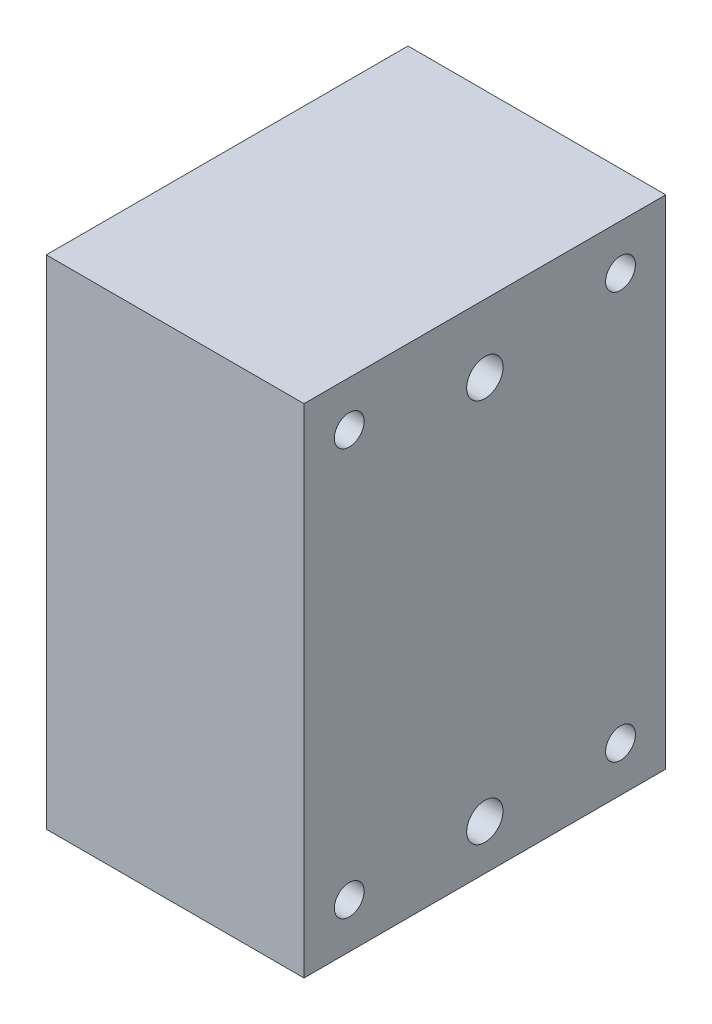
ISO-10303-21;
HEADER;
FILE_DESCRIPTION(('STEP AP214'),'2;1');
FILE_NAME('part.step','',(''),(''),'','','');
FILE_SCHEMA(('AUTOMOTIVE_DESIGN { 1 0 10303 214 1 1 1 1 }'));
ENDSEC;
DATA;
#1=APPLICATION_CONTEXT('core data for automotive mechanical design processes');
#2=APPLICATION_PROTOCOL_DEFINITION('international standard','automotive_design',2000,#1);
#3=PRODUCT_CONTEXT('',#1,'mechanical');
#4=PRODUCT('Part','Part','',(#3));
#5=PRODUCT_RELATED_PRODUCT_CATEGORY('part','',(#4));
#6=PRODUCT_DEFINITION_FORMATION('','',#4);
#7=PRODUCT_DEFINITION_CONTEXT('part definition',#1,'design');
#8=PRODUCT_DEFINITION('design','',#6,#7);
#9=PRODUCT_DEFINITION_SHAPE('','',#8);
#10=(LENGTH_UNIT() NAMED_UNIT(*) SI_UNIT(.MILLI.,.METRE.));
#11=(NAMED_UNIT(*) PLANE_ANGLE_UNIT() SI_UNIT($,.RADIAN.));
#12=(NAMED_UNIT(*) SI_UNIT($,.STERADIAN.) SOLID_ANGLE_UNIT());
#13=UNCERTAINTY_MEASURE_WITH_UNIT(LENGTH_MEASURE(1.E-05),#10,'distance_accuracy_value','');
#14=(GEOMETRIC_REPRESENTATION_CONTEXT(3) GLOBAL_UNCERTAINTY_ASSIGNED_CONTEXT((#13)) GLOBAL_UNIT_ASSIGNED_CONTEXT((#10,
#11,#12)) REPRESENTATION_CONTEXT('',''));
#15=CARTESIAN_POINT('',(0.,0.,0.));
#16=DIRECTION('',(0.,0.,1.));
#17=DIRECTION('',(1.,0.,0.));
#18=AXIS2_PLACEMENT_3D('',#15,#16,#17);
#19=CARTESIAN_POINT('',(7.99999999998136,20.,0.));
#20=DIRECTION('',(-1.,0.,0.));
#21=DIRECTION('',(0.,0.,1.));
#22=AXIS2_PLACEMENT_3D('',#19,#20,#21);
#23=CONICAL_SURFACE('',#22,1.89999999992098,1.02974425854218);
#24=CARTESIAN_POINT('',(9.14163517620636,20.,-8.52790060790198E-11));
#25=VERTEX_POINT('',#24);
#26=VERTEX_LOOP('',#25);
#27=FACE_BOUND('',#26,.T.);
#28=CARTESIAN_POINT('',(7.99999999999999,20.,0.));
#29=DIRECTION('',(-1.,0.,0.));
#30=DIRECTION('',(0.,0.,1.));
#31=AXIS2_PLACEMENT_3D('',#28,#29,#30);
#32=CIRCLE('',#31,1.9);
#33=CARTESIAN_POINT('',(7.99999999999999,20.,1.89999999999999));
#34=VERTEX_POINT('',#33);
#35=EDGE_CURVE('E95',#34,#34,#32,.T.);
#36=ORIENTED_EDGE('',*,*,#35,.T.);
#37=EDGE_LOOP('',(#36));
#38=FACE_BOUND('',#37,.T.);
#39=ADVANCED_FACE('F16',(#27,#38),#23,.F.);
#40=CARTESIAN_POINT('',(7.99999999998136,-22.5,0.));
#41=DIRECTION('',(-1.,0.,0.));
#42=DIRECTION('',(0.,0.,1.));
#43=AXIS2_PLACEMENT_3D('',#40,#41,#42);
#44=CONICAL_SURFACE('',#43,1.89999999992098,1.02974425854218);
#45=CARTESIAN_POINT('',(9.14163517614952,-22.5,1.98951966012828E-10));
#46=VERTEX_POINT('',#45);
#47=VERTEX_LOOP('',#46);
#48=FACE_BOUND('',#47,.T.);
#49=CARTESIAN_POINT('',(7.99999999999999,-22.5,0.));
#50=DIRECTION('',(-1.,0.,0.));
#51=DIRECTION('',(0.,0.,1.));
#52=AXIS2_PLACEMENT_3D('',#49,#50,#51);
#53=CIRCLE('',#52,1.9);
#54=CARTESIAN_POINT('',(7.99999999999999,-22.5,1.89999999999999));
#55=VERTEX_POINT('',#54);
#56=EDGE_CURVE('E97',#55,#55,#53,.T.);
#57=ORIENTED_EDGE('',*,*,#56,.T.);
#58=EDGE_LOOP('',(#57));
#59=FACE_BOUND('',#58,.T.);
#60=ADVANCED_FACE('F92',(#48,#59),#44,.F.);
#61=CARTESIAN_POINT('',(0.,20.,0.));
#62=DIRECTION('',(-1.,0.,0.));
#63=DIRECTION('',(0.,0.,1.));
#64=AXIS2_PLACEMENT_3D('',#61,#62,#63);
#65=CYLINDRICAL_SURFACE('',#64,1.9);
#66=ORIENTED_EDGE('',*,*,#35,.F.);
#67=EDGE_LOOP('',(#66));
#68=FACE_BOUND('',#67,.T.);
#69=CARTESIAN_POINT('',(5.,20.,0.));
#70=DIRECTION('',(-1.,0.,0.));
#71=DIRECTION('',(0.,0.,1.));
#72=AXIS2_PLACEMENT_3D('',#69,#70,#71);
#73=CIRCLE('',#72,1.9);
#74=CARTESIAN_POINT('',(5.,20.,1.89999999999999));
#75=VERTEX_POINT('',#74);
#76=EDGE_CURVE('E19',#75,#75,#73,.T.);
#77=ORIENTED_EDGE('',*,*,#76,.T.);
#78=EDGE_LOOP('',(#77));
#79=FACE_BOUND('',#78,.T.);
#80=ADVANCED_FACE('F170',(#68,#79),#65,.F.);
#81=CARTESIAN_POINT('',(0.,-22.5,0.));
#82=DIRECTION('',(-1.,0.,0.));
#83=DIRECTION('',(0.,0.,1.));
#84=AXIS2_PLACEMENT_3D('',#81,#82,#83);
#85=CYLINDRICAL_SURFACE('',#84,1.9);
#86=ORIENTED_EDGE('',*,*,#56,.F.);
#87=EDGE_LOOP('',(#86));
#88=FACE_BOUND('',#87,.T.);
#89=CARTESIAN_POINT('',(5.,-22.5,0.));
#90=DIRECTION('',(-1.,0.,0.));
#91=DIRECTION('',(0.,0.,1.));
#92=AXIS2_PLACEMENT_3D('',#89,#90,#91);
#93=CIRCLE('',#92,1.9);
#94=CARTESIAN_POINT('',(5.,-22.5,1.89999999999999));
#95=VERTEX_POINT('',#94);
#96=EDGE_CURVE('E160',#95,#95,#93,.T.);
#97=ORIENTED_EDGE('',*,*,#96,.T.);
#98=EDGE_LOOP('',(#97));
#99=FACE_BOUND('',#98,.T.);
#100=ADVANCED_FACE('F305',(#88,#99),#85,.F.);
#101=CARTESIAN_POINT('',(20.5000000000268,20.,0.));
#102=DIRECTION('',(1.,0.,0.));
#103=DIRECTION('',(0.,0.,-1.));
#104=AXIS2_PLACEMENT_3D('',#101,#102,#103);
#105=CONICAL_SURFACE('',#104,1.89999999992095,1.02974425854217);
#106=CARTESIAN_POINT('',(19.3583648238018,20.,8.52512505034042E-11));
#107=VERTEX_POINT('',#106);
#108=VERTEX_LOOP('',#107);
#109=FACE_BOUND('',#108,.T.);
#110=CARTESIAN_POINT('',(20.5,20.,0.));
#111=DIRECTION('',(1.,0.,0.));
#112=DIRECTION('',(0.,0.,-1.));
#113=AXIS2_PLACEMENT_3D('',#110,#111,#112);
#114=CIRCLE('',#113,1.90000000000001);
#115=CARTESIAN_POINT('',(20.5,20.,-1.90000000000002));
#116=VERTEX_POINT('',#115);
#117=EDGE_CURVE('E162',#116,#116,#114,.T.);
#118=ORIENTED_EDGE('',*,*,#117,.T.);
#119=EDGE_LOOP('',(#118));
#120=FACE_BOUND('',#119,.T.);
#121=ADVANCED_FACE('F302',(#109,#120),#105,.F.);
#122=CARTESIAN_POINT('',(20.5000000000268,-22.5,0.));
#123=DIRECTION('',(1.,0.,0.));
#124=DIRECTION('',(0.,0.,-1.));
#125=AXIS2_PLACEMENT_3D('',#122,#123,#124);
#126=CONICAL_SURFACE('',#125,1.89999999992095,1.02974425854217);
#127=CARTESIAN_POINT('',(19.3583648238587,-22.5,-1.98951966012828E-10));
#128=VERTEX_POINT('',#127);
#129=VERTEX_LOOP('',#128);
#130=FACE_BOUND('',#129,.T.);
#131=CARTESIAN_POINT('',(20.5,-22.5,0.));
#132=DIRECTION('',(1.,0.,0.));
#133=DIRECTION('',(0.,0.,-1.));
#134=AXIS2_PLACEMENT_3D('',#131,#132,#133);
#135=CIRCLE('',#134,1.90000000000001);
#136=CARTESIAN_POINT('',(20.5,-22.5,-1.90000000000002));
#137=VERTEX_POINT('',#136);
#138=EDGE_CURVE('E166',#137,#137,#135,.T.);
#139=ORIENTED_EDGE('',*,*,#138,.T.);
#140=EDGE_LOOP('',(#139));
#141=FACE_BOUND('',#140,.T.);
#142=ADVANCED_FACE('F304',(#130,#141),#126,.F.);
#143=CARTESIAN_POINT('',(11.5000000000691,22.5,-15.));
#144=DIRECTION('',(-1.,0.,0.));
#145=DIRECTION('',(0.,0.,1.));
#146=AXIS2_PLACEMENT_3D('',#143,#144,#145);
#147=CONICAL_SURFACE('',#146,1.64999999994052,1.02974425858201);
#148=CARTESIAN_POINT('',(12.4914200214619,22.5,-14.9999999999432));
#149=VERTEX_POINT('',#148);
#150=VERTEX_LOOP('',#149);
#151=FACE_BOUND('',#150,.T.);
#152=CARTESIAN_POINT('',(11.5,22.5,-15.));
#153=DIRECTION('',(-1.,0.,0.));
#154=DIRECTION('',(0.,0.,1.));
#155=AXIS2_PLACEMENT_3D('',#152,#153,#154);
#156=CIRCLE('',#155,1.64999999999999);
#157=CARTESIAN_POINT('',(11.5,22.5,-13.35));
#158=VERTEX_POINT('',#157);
#159=EDGE_CURVE('E581',#158,#158,#156,.T.);
#160=ORIENTED_EDGE('',*,*,#159,.T.);
#161=EDGE_LOOP('',(#160));
#162=FACE_BOUND('',#161,.T.);
#163=ADVANCED_FACE('F312',(#151,#162),#147,.F.);
#164=CARTESIAN_POINT('',(11.5000000000691,22.5,15.));
#165=DIRECTION('',(-1.,0.,0.));
#166=DIRECTION('',(0.,0.,1.));
#167=AXIS2_PLACEMENT_3D('',#164,#165,#166);
#168=CONICAL_SURFACE('',#167,1.64999999997009,1.02974425859784);
#169=CARTESIAN_POINT('',(12.4914200214903,22.5,15.));
#170=VERTEX_POINT('',#169);
#171=VERTEX_LOOP('',#170);
#172=FACE_BOUND('',#171,.T.);
#173=CARTESIAN_POINT('',(11.5,22.5,15.));
#174=DIRECTION('',(-1.,0.,0.));
#175=DIRECTION('',(0.,0.,1.));
#176=AXIS2_PLACEMENT_3D('',#173,#174,#175);
#177=CIRCLE('',#176,1.64999999999999);
#178=CARTESIAN_POINT('',(11.5,22.5,16.65));
#179=VERTEX_POINT('',#178);
#180=EDGE_CURVE('E576',#179,#179,#177,.T.);
#181=ORIENTED_EDGE('',*,*,#180,.T.);
#182=EDGE_LOOP('',(#181));
#183=FACE_BOUND('',#182,.T.);
#184=ADVANCED_FACE('F360',(#172,#183),#168,.F.);
#185=CARTESIAN_POINT('',(11.5000000000691,-22.5,15.));
#186=DIRECTION('',(-1.,0.,0.));
#187=DIRECTION('',(0.,0.,1.));
#188=AXIS2_PLACEMENT_3D('',#185,#186,#187);
#189=CONICAL_SURFACE('',#188,1.64999999997009,1.02974425859784);
#190=CARTESIAN_POINT('',(12.4914200214903,-22.5,15.));
#191=VERTEX_POINT('',#190);
#192=VERTEX_LOOP('',#191);
#193=FACE_BOUND('',#192,.T.);
#194=CARTESIAN_POINT('',(11.5,-22.5,15.));
#195=DIRECTION('',(-1.,0.,0.));
#196=DIRECTION('',(0.,0.,1.));
#197=AXIS2_PLACEMENT_3D('',#194,#195,#196);
#198=CIRCLE('',#197,1.64999999999999);
#199=CARTESIAN_POINT('',(11.5,-22.5,16.65));
#200=VERTEX_POINT('',#199);
#201=EDGE_CURVE('E574',#200,#200,#198,.T.);
#202=ORIENTED_EDGE('',*,*,#201,.T.);
#203=EDGE_LOOP('',(#202));
#204=FACE_BOUND('',#203,.T.);
#205=ADVANCED_FACE('F186',(#193,#204),#189,.F.);
#206=CARTESIAN_POINT('',(11.5000000000691,-22.5,-15.));
#207=DIRECTION('',(-1.,0.,0.));
#208=DIRECTION('',(0.,0.,1.));
#209=AXIS2_PLACEMENT_3D('',#206,#207,#208);
#210=CONICAL_SURFACE('',#209,1.64999999994052,1.02974425858201);
#211=CARTESIAN_POINT('',(12.4914200214619,-22.5,-14.9999999999432));
#212=VERTEX_POINT('',#211);
#213=VERTEX_LOOP('',#212);
#214=FACE_BOUND('',#213,.T.);
#215=CARTESIAN_POINT('',(11.5,-22.5,-15.));
#216=DIRECTION('',(-1.,0.,0.));
#217=DIRECTION('',(0.,0.,1.));
#218=AXIS2_PLACEMENT_3D('',#215,#216,#217);
#219=CIRCLE('',#218,1.64999999999999);
#220=CARTESIAN_POINT('',(11.5,-22.5,-13.35));
#221=VERTEX_POINT('',#220);
#222=EDGE_CURVE('E159',#221,#221,#219,.T.);
#223=ORIENTED_EDGE('',*,*,#222,.T.);
#224=EDGE_LOOP('',(#223));
#225=FACE_BOUND('',#224,.T.);
#226=ADVANCED_FACE('F175',(#214,#225),#210,.F.);
#227=CARTESIAN_POINT('',(5.,21.9,0.));
#228=DIRECTION('',(1.,0.,0.));
#229=DIRECTION('',(0.,0.,-1.));
#230=AXIS2_PLACEMENT_3D('',#227,#228,#229);
#231=PLANE('',#230);
#232=CARTESIAN_POINT('',(5.,20.,0.));
#233=DIRECTION('',(-1.,0.,0.));
#234=DIRECTION('',(0.,0.,1.));
#235=AXIS2_PLACEMENT_3D('',#232,#233,#234);
#236=CIRCLE('',#235,2.01);
#237=CARTESIAN_POINT('',(5.,20.,2.00999999999999));
#238=VERTEX_POINT('',#237);
#239=EDGE_CURVE('E157',#238,#238,#236,.T.);
#240=ORIENTED_EDGE('',*,*,#239,.T.);
#241=EDGE_LOOP('',(#240));
#242=FACE_BOUND('',#241,.T.);
#243=ORIENTED_EDGE('',*,*,#76,.F.);
#244=EDGE_LOOP('',(#243));
#245=FACE_BOUND('',#244,.T.);
#246=ADVANCED_FACE('F172',(#242,#245),#231,.F.);
#247=CARTESIAN_POINT('',(5.,-20.6,0.));
#248=DIRECTION('',(1.,0.,0.));
#249=DIRECTION('',(0.,0.,-1.));
#250=AXIS2_PLACEMENT_3D('',#247,#248,#249);
#251=PLANE('',#250);
#252=CARTESIAN_POINT('',(5.,-22.5,0.));
#253=DIRECTION('',(-1.,0.,0.));
#254=DIRECTION('',(0.,0.,1.));
#255=AXIS2_PLACEMENT_3D('',#252,#253,#254);
#256=CIRCLE('',#255,2.01);
#257=CARTESIAN_POINT('',(5.,-22.5,2.00999999999999));
#258=VERTEX_POINT('',#257);
#259=EDGE_CURVE('E154',#258,#258,#256,.T.);
#260=ORIENTED_EDGE('',*,*,#259,.T.);
#261=EDGE_LOOP('',(#260));
#262=FACE_BOUND('',#261,.T.);
#263=ORIENTED_EDGE('',*,*,#96,.F.);
#264=EDGE_LOOP('',(#263));
#265=FACE_BOUND('',#264,.T.);
#266=ADVANCED_FACE('F174',(#262,#265),#251,.F.);
#267=CARTESIAN_POINT('',(28.5,20.,0.));
#268=DIRECTION('',(1.,0.,0.));
#269=DIRECTION('',(0.,0.,-1.));
#270=AXIS2_PLACEMENT_3D('',#267,#268,#269);
#271=CYLINDRICAL_SURFACE('',#270,1.90000000000001);
#272=ORIENTED_EDGE('',*,*,#117,.F.);
#273=EDGE_LOOP('',(#272));
#274=FACE_BOUND('',#273,.T.);
#275=CARTESIAN_POINT('',(23.5,20.,0.));
#276=DIRECTION('',(1.,0.,0.));
#277=DIRECTION('',(0.,0.,-1.));
#278=AXIS2_PLACEMENT_3D('',#275,#276,#277);
#279=CIRCLE('',#278,1.90000000000001);
#280=CARTESIAN_POINT('',(23.5,20.,-1.90000000000002));
#281=VERTEX_POINT('',#280);
#282=EDGE_CURVE('E151',#281,#281,#279,.T.);
#283=ORIENTED_EDGE('',*,*,#282,.T.);
#284=EDGE_LOOP('',(#283));
#285=FACE_BOUND('',#284,.T.);
#286=ADVANCED_FACE('F183',(#274,#285),#271,.F.);
#287=CARTESIAN_POINT('',(28.5,-22.5,0.));
#288=DIRECTION('',(1.,0.,0.));
#289=DIRECTION('',(0.,0.,-1.));
#290=AXIS2_PLACEMENT_3D('',#287,#288,#289);
#291=CYLINDRICAL_SURFACE('',#290,1.90000000000001);
#292=ORIENTED_EDGE('',*,*,#138,.F.);
#293=EDGE_LOOP('',(#292));
#294=FACE_BOUND('',#293,.T.);
#295=CARTESIAN_POINT('',(23.5,-22.5,0.));
#296=DIRECTION('',(1.,0.,0.));
#297=DIRECTION('',(0.,0.,-1.));
#298=AXIS2_PLACEMENT_3D('',#295,#296,#297);
#299=CIRCLE('',#298,1.90000000000001);
#300=CARTESIAN_POINT('',(23.5,-22.5,-1.90000000000002));
#301=VERTEX_POINT('',#300);
#302=EDGE_CURVE('E148',#301,#301,#299,.T.);
#303=ORIENTED_EDGE('',*,*,#302,.T.);
#304=EDGE_LOOP('',(#303));
#305=FACE_BOUND('',#304,.T.);
#306=ADVANCED_FACE('F288',(#294,#305),#291,.F.);
#307=CARTESIAN_POINT('',(0.,22.5,-15.));
#308=DIRECTION('',(-1.,0.,0.));
#309=DIRECTION('',(0.,0.,1.));
#310=AXIS2_PLACEMENT_3D('',#307,#308,#309);
#311=CYLINDRICAL_SURFACE('',#310,1.64999999999999);
#312=CARTESIAN_POINT('',(0.,22.5,-15.));
#313=DIRECTION('',(-1.,0.,0.));
#314=DIRECTION('',(0.,0.,1.));
#315=AXIS2_PLACEMENT_3D('',#312,#313,#314);
#316=CIRCLE('',#315,1.64999999999999);
#317=CARTESIAN_POINT('',(0.,22.5,-13.35));
#318=VERTEX_POINT('',#317);
#319=EDGE_CURVE('E145',#318,#318,#316,.F.);
#320=ORIENTED_EDGE('',*,*,#319,.F.);
#321=EDGE_LOOP('',(#320));
#322=FACE_BOUND('',#321,.T.);
#323=ORIENTED_EDGE('',*,*,#159,.F.);
#324=EDGE_LOOP('',(#323));
#325=FACE_BOUND('',#324,.T.);
#326=ADVANCED_FACE('F284',(#322,#325),#311,.F.);
#327=CARTESIAN_POINT('',(0.,22.5,15.));
#328=DIRECTION('',(-1.,0.,0.));
#329=DIRECTION('',(0.,0.,1.));
#330=AXIS2_PLACEMENT_3D('',#327,#328,#329);
#331=CYLINDRICAL_SURFACE('',#330,1.64999999999999);
#332=CARTESIAN_POINT('',(0.,22.5,15.));
#333=DIRECTION('',(-1.,0.,0.));
#334=DIRECTION('',(0.,0.,1.));
#335=AXIS2_PLACEMENT_3D('',#332,#333,#334);
#336=CIRCLE('',#335,1.64999999999999);
#337=CARTESIAN_POINT('',(0.,22.5,16.65));
#338=VERTEX_POINT('',#337);
#339=EDGE_CURVE('E142',#338,#338,#336,.F.);
#340=ORIENTED_EDGE('',*,*,#339,.F.);
#341=EDGE_LOOP('',(#340));
#342=FACE_BOUND('',#341,.T.);
#343=ORIENTED_EDGE('',*,*,#180,.F.);
#344=EDGE_LOOP('',(#343));
#345=FACE_BOUND('',#344,.T.);
#346=ADVANCED_FACE('F280',(#342,#345),#331,.F.);
#347=CARTESIAN_POINT('',(0.,-22.5,15.));
#348=DIRECTION('',(-1.,0.,0.));
#349=DIRECTION('',(0.,0.,1.));
#350=AXIS2_PLACEMENT_3D('',#347,#348,#349);
#351=CYLINDRICAL_SURFACE('',#350,1.64999999999999);
#352=CARTESIAN_POINT('',(0.,-22.5,15.));
#353=DIRECTION('',(-1.,0.,0.));
#354=DIRECTION('',(0.,0.,1.));
#355=AXIS2_PLACEMENT_3D('',#352,#353,#354);
#356=CIRCLE('',#355,1.64999999999999);
#357=CARTESIAN_POINT('',(0.,-22.5,16.65));
#358=VERTEX_POINT('',#357);
#359=EDGE_CURVE('E139',#358,#358,#356,.F.);
#360=ORIENTED_EDGE('',*,*,#359,.F.);
#361=EDGE_LOOP('',(#360));
#362=FACE_BOUND('',#361,.T.);
#363=ORIENTED_EDGE('',*,*,#201,.F.);
#364=EDGE_LOOP('',(#363));
#365=FACE_BOUND('',#364,.T.);
#366=ADVANCED_FACE('F276',(#362,#365),#351,.F.);
#367=CARTESIAN_POINT('',(0.,-22.5,-15.));
#368=DIRECTION('',(-1.,0.,0.));
#369=DIRECTION('',(0.,0.,1.));
#370=AXIS2_PLACEMENT_3D('',#367,#368,#369);
#371=CYLINDRICAL_SURFACE('',#370,1.64999999999999);
#372=CARTESIAN_POINT('',(0.,-22.5,-15.));
#373=DIRECTION('',(-1.,0.,0.));
#374=DIRECTION('',(0.,0.,1.));
#375=AXIS2_PLACEMENT_3D('',#372,#373,#374);
#376=CIRCLE('',#375,1.64999999999999);
#377=CARTESIAN_POINT('',(0.,-22.5,-13.35));
#378=VERTEX_POINT('',#377);
#379=EDGE_CURVE('E136',#378,#378,#376,.F.);
#380=ORIENTED_EDGE('',*,*,#379,.F.);
#381=EDGE_LOOP('',(#380));
#382=FACE_BOUND('',#381,.T.);
#383=ORIENTED_EDGE('',*,*,#222,.F.);
#384=EDGE_LOOP('',(#383));
#385=FACE_BOUND('',#384,.T.);
#386=ADVANCED_FACE('F272',(#382,#385),#371,.F.);
#387=CARTESIAN_POINT('',(0.,20.,0.));
#388=DIRECTION('',(-1.,0.,0.));
#389=DIRECTION('',(0.,0.,1.));
#390=AXIS2_PLACEMENT_3D('',#387,#388,#389);
#391=CYLINDRICAL_SURFACE('',#390,2.01);
#392=CARTESIAN_POINT('',(0.,20.,0.));
#393=DIRECTION('',(-1.,0.,0.));
#394=DIRECTION('',(0.,0.,1.));
#395=AXIS2_PLACEMENT_3D('',#392,#393,#394);
#396=CIRCLE('',#395,2.01);
#397=CARTESIAN_POINT('',(0.,20.,2.00999999999999));
#398=VERTEX_POINT('',#397);
#399=EDGE_CURVE('E133',#398,#398,#396,.F.);
#400=ORIENTED_EDGE('',*,*,#399,.F.);
#401=EDGE_LOOP('',(#400));
#402=FACE_BOUND('',#401,.T.);
#403=ORIENTED_EDGE('',*,*,#239,.F.);
#404=EDGE_LOOP('',(#403));
#405=FACE_BOUND('',#404,.T.);
#406=ADVANCED_FACE('F268',(#402,#405),#391,.F.);
#407=CARTESIAN_POINT('',(0.,-22.5,0.));
#408=DIRECTION('',(-1.,0.,0.));
#409=DIRECTION('',(0.,0.,1.));
#410=AXIS2_PLACEMENT_3D('',#407,#408,#409);
#411=CYLINDRICAL_SURFACE('',#410,2.01);
#412=CARTESIAN_POINT('',(0.,-22.5,0.));
#413=DIRECTION('',(-1.,0.,0.));
#414=DIRECTION('',(0.,0.,1.));
#415=AXIS2_PLACEMENT_3D('',#412,#413,#414);
#416=CIRCLE('',#415,2.01);
#417=CARTESIAN_POINT('',(0.,-22.5,2.00999999999999));
#418=VERTEX_POINT('',#417);
#419=EDGE_CURVE('E130',#418,#418,#416,.F.);
#420=ORIENTED_EDGE('',*,*,#419,.F.);
#421=EDGE_LOOP('',(#420));
#422=FACE_BOUND('',#421,.T.);
#423=ORIENTED_EDGE('',*,*,#259,.F.);
#424=EDGE_LOOP('',(#423));
#425=FACE_BOUND('',#424,.T.);
#426=ADVANCED_FACE('F264',(#422,#425),#411,.F.);
#427=CARTESIAN_POINT('',(23.5,21.9,0.));
#428=DIRECTION('',(-1.,0.,0.));
#429=DIRECTION('',(0.,0.,1.));
#430=AXIS2_PLACEMENT_3D('',#427,#428,#429);
#431=PLANE('',#430);
#432=CARTESIAN_POINT('',(23.5,20.,0.));
#433=DIRECTION('',(1.,0.,0.));
#434=DIRECTION('',(0.,0.,-1.));
#435=AXIS2_PLACEMENT_3D('',#432,#433,#434);
#436=CIRCLE('',#435,2.01);
#437=CARTESIAN_POINT('',(23.5,20.,-2.01000000000002));
#438=VERTEX_POINT('',#437);
#439=EDGE_CURVE('E127',#438,#438,#436,.T.);
#440=ORIENTED_EDGE('',*,*,#439,.T.);
#441=EDGE_LOOP('',(#440));
#442=FACE_BOUND('',#441,.T.);
#443=ORIENTED_EDGE('',*,*,#282,.F.);
#444=EDGE_LOOP('',(#443));
#445=FACE_BOUND('',#444,.T.);
#446=ADVANCED_FACE('F260',(#442,#445),#431,.F.);
#447=CARTESIAN_POINT('',(23.5,-20.6,0.));
#448=DIRECTION('',(-1.,0.,0.));
#449=DIRECTION('',(0.,0.,1.));
#450=AXIS2_PLACEMENT_3D('',#447,#448,#449);
#451=PLANE('',#450);
#452=CARTESIAN_POINT('',(23.5,-22.5,0.));
#453=DIRECTION('',(1.,0.,0.));
#454=DIRECTION('',(0.,0.,-1.));
#455=AXIS2_PLACEMENT_3D('',#452,#453,#454);
#456=CIRCLE('',#455,2.01);
#457=CARTESIAN_POINT('',(23.5,-22.5,-2.01000000000002));
#458=VERTEX_POINT('',#457);
#459=EDGE_CURVE('E123',#458,#458,#456,.T.);
#460=ORIENTED_EDGE('',*,*,#459,.T.);
#461=EDGE_LOOP('',(#460));
#462=FACE_BOUND('',#461,.T.);
#463=ORIENTED_EDGE('',*,*,#302,.F.);
#464=EDGE_LOOP('',(#463));
#465=FACE_BOUND('',#464,.T.);
#466=ADVANCED_FACE('F256',(#462,#465),#451,.F.);
#467=CARTESIAN_POINT('',(16.9999999999959,22.5,15.));
#468=DIRECTION('',(1.,0.,0.));
#469=DIRECTION('',(0.,0.,-1.));
#470=AXIS2_PLACEMENT_3D('',#467,#468,#469);
#471=CONICAL_SURFACE('',#470,1.64999999999735,1.02974425867096);
#472=CARTESIAN_POINT('',(16.0085799786316,22.5,15.));
#473=VERTEX_POINT('',#472);
#474=VERTEX_LOOP('',#473);
#475=FACE_BOUND('',#474,.T.);
#476=CARTESIAN_POINT('',(17.,22.5,15.));
#477=DIRECTION('',(1.,0.,0.));
#478=DIRECTION('',(0.,0.,-1.));
#479=AXIS2_PLACEMENT_3D('',#476,#477,#478);
#480=CIRCLE('',#479,1.64999999999999);
#481=CARTESIAN_POINT('',(17.,22.5,13.35));
#482=VERTEX_POINT('',#481);
#483=EDGE_CURVE('E126',#482,#482,#480,.T.);
#484=ORIENTED_EDGE('',*,*,#483,.T.);
#485=EDGE_LOOP('',(#484));
#486=FACE_BOUND('',#485,.T.);
#487=ADVANCED_FACE('F252',(#475,#486),#471,.F.);
#488=CARTESIAN_POINT('',(16.9999999999391,22.5,-15.));
#489=DIRECTION('',(1.,0.,0.));
#490=DIRECTION('',(0.,0.,-1.));
#491=AXIS2_PLACEMENT_3D('',#488,#489,#490);
#492=CONICAL_SURFACE('',#491,1.64999999997007,1.02974425863835);
#493=CARTESIAN_POINT('',(16.0085799785179,22.5,-15.));
#494=VERTEX_POINT('',#493);
#495=VERTEX_LOOP('',#494);
#496=FACE_BOUND('',#495,.T.);
#497=CARTESIAN_POINT('',(17.,22.5,-15.));
#498=DIRECTION('',(1.,0.,0.));
#499=DIRECTION('',(0.,0.,-1.));
#500=AXIS2_PLACEMENT_3D('',#497,#498,#499);
#501=CIRCLE('',#500,1.64999999999999);
#502=CARTESIAN_POINT('',(17.,22.5,-16.65));
#503=VERTEX_POINT('',#502);
#504=EDGE_CURVE('E598',#503,#503,#501,.T.);
#505=ORIENTED_EDGE('',*,*,#504,.T.);
#506=EDGE_LOOP('',(#505));
#507=FACE_BOUND('',#506,.T.);
#508=ADVANCED_FACE('F248',(#496,#507),#492,.F.);
#509=CARTESIAN_POINT('',(16.9999999999391,-22.5,-15.));
#510=DIRECTION('',(1.,0.,0.));
#511=DIRECTION('',(0.,0.,-1.));
#512=AXIS2_PLACEMENT_3D('',#509,#510,#511);
#513=CONICAL_SURFACE('',#512,1.64999999997007,1.02974425863835);
#514=CARTESIAN_POINT('',(16.0085799785179,-22.5,-15.));
#515=VERTEX_POINT('',#514);
#516=VERTEX_LOOP('',#515);
#517=FACE_BOUND('',#516,.T.);
#518=CARTESIAN_POINT('',(17.,-22.5,-15.));
#519=DIRECTION('',(1.,0.,0.));
#520=DIRECTION('',(0.,0.,-1.));
#521=AXIS2_PLACEMENT_3D('',#518,#519,#520);
#522=CIRCLE('',#521,1.64999999999999);
#523=CARTESIAN_POINT('',(17.,-22.5,-16.65));
#524=VERTEX_POINT('',#523);
#525=EDGE_CURVE('E601',#524,#524,#522,.T.);
#526=ORIENTED_EDGE('',*,*,#525,.T.);
#527=EDGE_LOOP('',(#526));
#528=FACE_BOUND('',#527,.T.);
#529=ADVANCED_FACE('F244',(#517,#528),#513,.F.);
#530=CARTESIAN_POINT('',(16.9999999999959,-22.5,15.));
#531=DIRECTION('',(1.,0.,0.));
#532=DIRECTION('',(0.,0.,-1.));
#533=AXIS2_PLACEMENT_3D('',#530,#531,#532);
#534=CONICAL_SURFACE('',#533,1.64999999999735,1.02974425867096);
#535=CARTESIAN_POINT('',(16.0085799786316,-22.5,15.));
#536=VERTEX_POINT('',#535);
#537=VERTEX_LOOP('',#536);
#538=FACE_BOUND('',#537,.T.);
#539=CARTESIAN_POINT('',(17.,-22.5,15.));
#540=DIRECTION('',(1.,0.,0.));
#541=DIRECTION('',(0.,0.,-1.));
#542=AXIS2_PLACEMENT_3D('',#539,#540,#541);
#543=CIRCLE('',#542,1.64999999999999);
#544=CARTESIAN_POINT('',(17.,-22.5,13.35));
#545=VERTEX_POINT('',#544);
#546=EDGE_CURVE('E604',#545,#545,#543,.T.);
#547=ORIENTED_EDGE('',*,*,#546,.T.);
#548=EDGE_LOOP('',(#547));
#549=FACE_BOUND('',#548,.T.);
#550=ADVANCED_FACE('F240',(#538,#549),#534,.F.);
#551=CARTESIAN_POINT('',(0.,0.,0.));
#552=DIRECTION('',(-1.,0.,0.));
#553=DIRECTION('',(0.,0.,1.));
#554=AXIS2_PLACEMENT_3D('',#551,#552,#553);
#555=PLANE('',#554);
#556=DIRECTION('',(0.,-1.,0.));
#557=VECTOR('',#556,1.);
#558=CARTESIAN_POINT('',(0.,27.5,-20.));
#559=LINE('',#558,#557);
#560=CARTESIAN_POINT('',(0.,27.5,-20.));
#561=VERTEX_POINT('',#560);
#562=CARTESIAN_POINT('',(0.,-27.5,-20.));
#563=VERTEX_POINT('',#562);
#564=EDGE_CURVE('E612',#561,#563,#559,.T.);
#565=ORIENTED_EDGE('',*,*,#564,.T.);
#566=DIRECTION('',(0.,0.,1.));
#567=VECTOR('',#566,1.);
#568=CARTESIAN_POINT('',(0.,-27.5,-20.));
#569=LINE('',#568,#567);
#570=CARTESIAN_POINT('',(0.,-27.5,20.));
#571=VERTEX_POINT('',#570);
#572=EDGE_CURVE('E617',#563,#571,#569,.T.);
#573=ORIENTED_EDGE('',*,*,#572,.T.);
#574=DIRECTION('',(0.,1.,0.));
#575=VECTOR('',#574,1.);
#576=CARTESIAN_POINT('',(0.,27.5,20.));
#577=LINE('',#576,#575);
#578=CARTESIAN_POINT('',(0.,27.5,20.));
#579=VERTEX_POINT('',#578);
#580=EDGE_CURVE('E122',#571,#579,#577,.T.);
#581=ORIENTED_EDGE('',*,*,#580,.T.);
#582=DIRECTION('',(0.,0.,-1.));
#583=VECTOR('',#582,1.);
#584=CARTESIAN_POINT('',(0.,27.5,-20.));
#585=LINE('',#584,#583);
#586=EDGE_CURVE('E607',#579,#561,#585,.T.);
#587=ORIENTED_EDGE('',*,*,#586,.T.);
#588=EDGE_LOOP('',(#565,#573,#581,#587));
#589=FACE_BOUND('',#588,.T.);
#590=ORIENTED_EDGE('',*,*,#419,.T.);
#591=EDGE_LOOP('',(#590));
#592=FACE_BOUND('',#591,.T.);
#593=ORIENTED_EDGE('',*,*,#399,.T.);
#594=EDGE_LOOP('',(#593));
#595=FACE_BOUND('',#594,.T.);
#596=ORIENTED_EDGE('',*,*,#379,.T.);
#597=EDGE_LOOP('',(#596));
#598=FACE_BOUND('',#597,.T.);
#599=ORIENTED_EDGE('',*,*,#359,.T.);
#600=EDGE_LOOP('',(#599));
#601=FACE_BOUND('',#600,.T.);
#602=ORIENTED_EDGE('',*,*,#339,.T.);
#603=EDGE_LOOP('',(#602));
#604=FACE_BOUND('',#603,.T.);
#605=ORIENTED_EDGE('',*,*,#319,.T.);
#606=EDGE_LOOP('',(#605));
#607=FACE_BOUND('',#606,.T.);
#608=ADVANCED_FACE('F236',(#589,#592,#595,#598,#601,#604,#607),#555,.T.);
#609=CARTESIAN_POINT('',(28.5,20.,0.));
#610=DIRECTION('',(1.,0.,0.));
#611=DIRECTION('',(0.,0.,-1.));
#612=AXIS2_PLACEMENT_3D('',#609,#610,#611);
#613=CYLINDRICAL_SURFACE('',#612,2.01);
#614=ORIENTED_EDGE('',*,*,#439,.F.);
#615=EDGE_LOOP('',(#614));
#616=FACE_BOUND('',#615,.T.);
#617=CARTESIAN_POINT('',(28.5,20.,0.));
#618=DIRECTION('',(1.,0.,0.));
#619=DIRECTION('',(0.,0.,-1.));
#620=AXIS2_PLACEMENT_3D('',#617,#618,#619);
#621=CIRCLE('',#620,2.01);
#622=CARTESIAN_POINT('',(28.5,20.,-2.01000000000002));
#623=VERTEX_POINT('',#622);
#624=EDGE_CURVE('E119',#623,#623,#621,.T.);
#625=ORIENTED_EDGE('',*,*,#624,.T.);
#626=EDGE_LOOP('',(#625));
#627=FACE_BOUND('',#626,.T.);
#628=ADVANCED_FACE('F232',(#616,#627),#613,.F.);
#629=CARTESIAN_POINT('',(28.5,-22.5,0.));
#630=DIRECTION('',(1.,0.,0.));
#631=DIRECTION('',(0.,0.,-1.));
#632=AXIS2_PLACEMENT_3D('',#629,#630,#631);
#633=CYLINDRICAL_SURFACE('',#632,2.01);
#634=ORIENTED_EDGE('',*,*,#459,.F.);
#635=EDGE_LOOP('',(#634));
#636=FACE_BOUND('',#635,.T.);
#637=CARTESIAN_POINT('',(28.5,-22.5,0.));
#638=DIRECTION('',(1.,0.,0.));
#639=DIRECTION('',(0.,0.,-1.));
#640=AXIS2_PLACEMENT_3D('',#637,#638,#639);
#641=CIRCLE('',#640,2.01);
#642=CARTESIAN_POINT('',(28.5,-22.5,-2.01000000000002));
#643=VERTEX_POINT('',#642);
#644=EDGE_CURVE('E116',#643,#643,#641,.T.);
#645=ORIENTED_EDGE('',*,*,#644,.T.);
#646=EDGE_LOOP('',(#645));
#647=FACE_BOUND('',#646,.T.);
#648=ADVANCED_FACE('F228',(#636,#647),#633,.F.);
#649=CARTESIAN_POINT('',(28.5,22.5,15.));
#650=DIRECTION('',(1.,0.,0.));
#651=DIRECTION('',(0.,0.,-1.));
#652=AXIS2_PLACEMENT_3D('',#649,#650,#651);
#653=CYLINDRICAL_SURFACE('',#652,1.64999999999999);
#654=ORIENTED_EDGE('',*,*,#483,.F.);
#655=EDGE_LOOP('',(#654));
#656=FACE_BOUND('',#655,.T.);
#657=CARTESIAN_POINT('',(28.5,22.5,15.));
#658=DIRECTION('',(1.,0.,0.));
#659=DIRECTION('',(0.,0.,-1.));
#660=AXIS2_PLACEMENT_3D('',#657,#658,#659);
#661=CIRCLE('',#660,1.64999999999999);
#662=CARTESIAN_POINT('',(28.5,22.5,13.35));
#663=VERTEX_POINT('',#662);
#664=EDGE_CURVE('E113',#663,#663,#661,.T.);
#665=ORIENTED_EDGE('',*,*,#664,.T.);
#666=EDGE_LOOP('',(#665));
#667=FACE_BOUND('',#666,.T.);
#668=ADVANCED_FACE('F224',(#656,#667),#653,.F.);
#669=CARTESIAN_POINT('',(28.5,22.5,-15.));
#670=DIRECTION('',(1.,0.,0.));
#671=DIRECTION('',(0.,0.,-1.));
#672=AXIS2_PLACEMENT_3D('',#669,#670,#671);
#673=CYLINDRICAL_SURFACE('',#672,1.64999999999999);
#674=ORIENTED_EDGE('',*,*,#504,.F.);
#675=EDGE_LOOP('',(#674));
#676=FACE_BOUND('',#675,.T.);
#677=CARTESIAN_POINT('',(28.5,22.5,-15.));
#678=DIRECTION('',(1.,0.,0.));
#679=DIRECTION('',(0.,0.,-1.));
#680=AXIS2_PLACEMENT_3D('',#677,#678,#679);
#681=CIRCLE('',#680,1.64999999999999);
#682=CARTESIAN_POINT('',(28.5,22.5,-16.65));
#683=VERTEX_POINT('',#682);
#684=EDGE_CURVE('E110',#683,#683,#681,.T.);
#685=ORIENTED_EDGE('',*,*,#684,.T.);
#686=EDGE_LOOP('',(#685));
#687=FACE_BOUND('',#686,.T.);
#688=ADVANCED_FACE('F220',(#676,#687),#673,.F.);
#689=CARTESIAN_POINT('',(28.5,-22.5,-15.));
#690=DIRECTION('',(1.,0.,0.));
#691=DIRECTION('',(0.,0.,-1.));
#692=AXIS2_PLACEMENT_3D('',#689,#690,#691);
#693=CYLINDRICAL_SURFACE('',#692,1.64999999999999);
#694=ORIENTED_EDGE('',*,*,#525,.F.);
#695=EDGE_LOOP('',(#694));
#696=FACE_BOUND('',#695,.T.);
#697=CARTESIAN_POINT('',(28.5,-22.5,-15.));
#698=DIRECTION('',(1.,0.,0.));
#699=DIRECTION('',(0.,0.,-1.));
#700=AXIS2_PLACEMENT_3D('',#697,#698,#699);
#701=CIRCLE('',#700,1.64999999999999);
#702=CARTESIAN_POINT('',(28.5,-22.5,-16.65));
#703=VERTEX_POINT('',#702);
#704=EDGE_CURVE('E107',#703,#703,#701,.T.);
#705=ORIENTED_EDGE('',*,*,#704,.T.);
#706=EDGE_LOOP('',(#705));
#707=FACE_BOUND('',#706,.T.);
#708=ADVANCED_FACE('F216',(#696,#707),#693,.F.);
#709=CARTESIAN_POINT('',(28.5,-22.5,15.));
#710=DIRECTION('',(1.,0.,0.));
#711=DIRECTION('',(0.,0.,-1.));
#712=AXIS2_PLACEMENT_3D('',#709,#710,#711);
#713=CYLINDRICAL_SURFACE('',#712,1.64999999999999);
#714=ORIENTED_EDGE('',*,*,#546,.F.);
#715=EDGE_LOOP('',(#714));
#716=FACE_BOUND('',#715,.T.);
#717=CARTESIAN_POINT('',(28.5,-22.5,15.));
#718=DIRECTION('',(1.,0.,0.));
#719=DIRECTION('',(0.,0.,-1.));
#720=AXIS2_PLACEMENT_3D('',#717,#718,#719);
#721=CIRCLE('',#720,1.64999999999999);
#722=CARTESIAN_POINT('',(28.5,-22.5,13.35));
#723=VERTEX_POINT('',#722);
#724=EDGE_CURVE('E103',#723,#723,#721,.T.);
#725=ORIENTED_EDGE('',*,*,#724,.T.);
#726=EDGE_LOOP('',(#725));
#727=FACE_BOUND('',#726,.T.);
#728=ADVANCED_FACE('F212',(#716,#727),#713,.F.);
#729=CARTESIAN_POINT('',(28.5,27.5,-20.));
#730=DIRECTION('',(0.,-1.,0.));
#731=DIRECTION('',(0.,0.,-1.));
#732=AXIS2_PLACEMENT_3D('',#729,#730,#731);
#733=PLANE('',#732);
#734=DIRECTION('',(1.,0.,0.));
#735=VECTOR('',#734,1.);
#736=CARTESIAN_POINT('',(28.5,27.5,20.));
#737=LINE('',#736,#735);
#738=CARTESIAN_POINT('',(28.5,27.5,20.));
#739=VERTEX_POINT('',#738);
#740=EDGE_CURVE('E619',#579,#739,#737,.T.);
#741=ORIENTED_EDGE('',*,*,#740,.T.);
#742=DIRECTION('',(0.,0.,1.));
#743=VECTOR('',#742,1.);
#744=CARTESIAN_POINT('',(28.5,27.5,0.));
#745=LINE('',#744,#743);
#746=CARTESIAN_POINT('',(28.5,27.5,-20.));
#747=VERTEX_POINT('',#746);
#748=EDGE_CURVE('E106',#739,#747,#745,.F.);
#749=ORIENTED_EDGE('',*,*,#748,.T.);
#750=DIRECTION('',(1.,0.,0.));
#751=VECTOR('',#750,1.);
#752=CARTESIAN_POINT('',(28.5,27.5,-20.));
#753=LINE('',#752,#751);
#754=EDGE_CURVE('E609',#747,#561,#753,.F.);
#755=ORIENTED_EDGE('',*,*,#754,.T.);
#756=ORIENTED_EDGE('',*,*,#586,.F.);
#757=EDGE_LOOP('',(#741,#749,#755,#756));
#758=FACE_BOUND('',#757,.T.);
#759=ADVANCED_FACE('F208',(#758),#733,.F.);
#760=CARTESIAN_POINT('',(28.5,27.5,-20.));
#761=DIRECTION('',(0.,0.,1.));
#762=DIRECTION('',(0.,-1.,0.));
#763=AXIS2_PLACEMENT_3D('',#760,#761,#762);
#764=PLANE('',#763);
#765=ORIENTED_EDGE('',*,*,#754,.F.);
#766=DIRECTION('',(0.,1.,0.));
#767=VECTOR('',#766,1.);
#768=CARTESIAN_POINT('',(28.5,0.,-20.));
#769=LINE('',#768,#767);
#770=CARTESIAN_POINT('',(28.5,-27.5,-20.));
#771=VERTEX_POINT('',#770);
#772=EDGE_CURVE('E627',#747,#771,#769,.F.);
#773=ORIENTED_EDGE('',*,*,#772,.T.);
#774=DIRECTION('',(1.,0.,0.));
#775=VECTOR('',#774,1.);
#776=CARTESIAN_POINT('',(28.5,-27.5,-20.));
#777=LINE('',#776,#775);
#778=EDGE_CURVE('E614',#771,#563,#777,.F.);
#779=ORIENTED_EDGE('',*,*,#778,.T.);
#780=ORIENTED_EDGE('',*,*,#564,.F.);
#781=EDGE_LOOP('',(#765,#773,#779,#780));
#782=FACE_BOUND('',#781,.T.);
#783=ADVANCED_FACE('F204',(#782),#764,.F.);
#784=CARTESIAN_POINT('',(28.5,-27.5,-20.));
#785=DIRECTION('',(0.,1.,0.));
#786=DIRECTION('',(0.,0.,1.));
#787=AXIS2_PLACEMENT_3D('',#784,#785,#786);
#788=PLANE('',#787);
#789=ORIENTED_EDGE('',*,*,#778,.F.);
#790=DIRECTION('',(0.,0.,1.));
#791=VECTOR('',#790,1.);
#792=CARTESIAN_POINT('',(28.5,-27.5,0.));
#793=LINE('',#792,#791);
#794=CARTESIAN_POINT('',(28.5,-27.5,20.));
#795=VERTEX_POINT('',#794);
#796=EDGE_CURVE('E25',#771,#795,#793,.T.);
#797=ORIENTED_EDGE('',*,*,#796,.T.);
#798=DIRECTION('',(1.,0.,0.));
#799=VECTOR('',#798,1.);
#800=CARTESIAN_POINT('',(28.5,-27.5,20.));
#801=LINE('',#800,#799);
#802=EDGE_CURVE('E33',#795,#571,#801,.F.);
#803=ORIENTED_EDGE('',*,*,#802,.T.);
#804=ORIENTED_EDGE('',*,*,#572,.F.);
#805=EDGE_LOOP('',(#789,#797,#803,#804));
#806=FACE_BOUND('',#805,.T.);
#807=ADVANCED_FACE('F197',(#806),#788,.F.);
#808=CARTESIAN_POINT('',(28.5,27.5,20.));
#809=DIRECTION('',(0.,0.,-1.));
#810=DIRECTION('',(0.,1.,0.));
#811=AXIS2_PLACEMENT_3D('',#808,#809,#810);
#812=PLANE('',#811);
#813=ORIENTED_EDGE('',*,*,#802,.F.);
#814=DIRECTION('',(0.,1.,0.));
#815=VECTOR('',#814,1.);
#816=CARTESIAN_POINT('',(28.5,0.,20.));
#817=LINE('',#816,#815);
#818=EDGE_CURVE('E11',#795,#739,#817,.T.);
#819=ORIENTED_EDGE('',*,*,#818,.T.);
#820=ORIENTED_EDGE('',*,*,#740,.F.);
#821=ORIENTED_EDGE('',*,*,#580,.F.);
#822=EDGE_LOOP('',(#813,#819,#820,#821));
#823=FACE_BOUND('',#822,.T.);
#824=ADVANCED_FACE('F191',(#823),#812,.F.);
#825=CARTESIAN_POINT('',(28.5,0.,0.));
#826=DIRECTION('',(-1.,0.,0.));
#827=DIRECTION('',(0.,0.,1.));
#828=AXIS2_PLACEMENT_3D('',#825,#826,#827);
#829=PLANE('',#828);
#830=ORIENTED_EDGE('',*,*,#796,.F.);
#831=ORIENTED_EDGE('',*,*,#772,.F.);
#832=ORIENTED_EDGE('',*,*,#748,.F.);
#833=ORIENTED_EDGE('',*,*,#818,.F.);
#834=EDGE_LOOP('',(#830,#831,#832,#833));
#835=FACE_BOUND('',#834,.T.);
#836=ORIENTED_EDGE('',*,*,#724,.F.);
#837=EDGE_LOOP('',(#836));
#838=FACE_BOUND('',#837,.T.);
#839=ORIENTED_EDGE('',*,*,#704,.F.);
#840=EDGE_LOOP('',(#839));
#841=FACE_BOUND('',#840,.T.);
#842=ORIENTED_EDGE('',*,*,#684,.F.);
#843=EDGE_LOOP('',(#842));
#844=FACE_BOUND('',#843,.T.);
#845=ORIENTED_EDGE('',*,*,#664,.F.);
#846=EDGE_LOOP('',(#845));
#847=FACE_BOUND('',#846,.T.);
#848=ORIENTED_EDGE('',*,*,#644,.F.);
#849=EDGE_LOOP('',(#848));
#850=FACE_BOUND('',#849,.T.);
#851=ORIENTED_EDGE('',*,*,#624,.F.);
#852=EDGE_LOOP('',(#851));
#853=FACE_BOUND('',#852,.T.);
#854=ADVANCED_FACE('F189',(#835,#838,#841,#844,#847,#850,#853),#829,.F.);
#855=CLOSED_SHELL('',(#39,#60,#80,#100,#121,#142,#163,#184,#205,#226,#246,#266,#286,#306,#326,
#346,#366,#386,#406,#426,#446,#466,#487,#508,#529,#550,#608,#628,#648,#668,#688,#708,#728,#759,
#783,#807,#824,#854));
#856=MANIFOLD_SOLID_BREP('B1',#855);
#857=ADVANCED_BREP_SHAPE_REPRESENTATION('',(#18,#856),#14);
#858=SHAPE_DEFINITION_REPRESENTATION(#9,#857);
ENDSEC;
END-ISO-10303-21;
